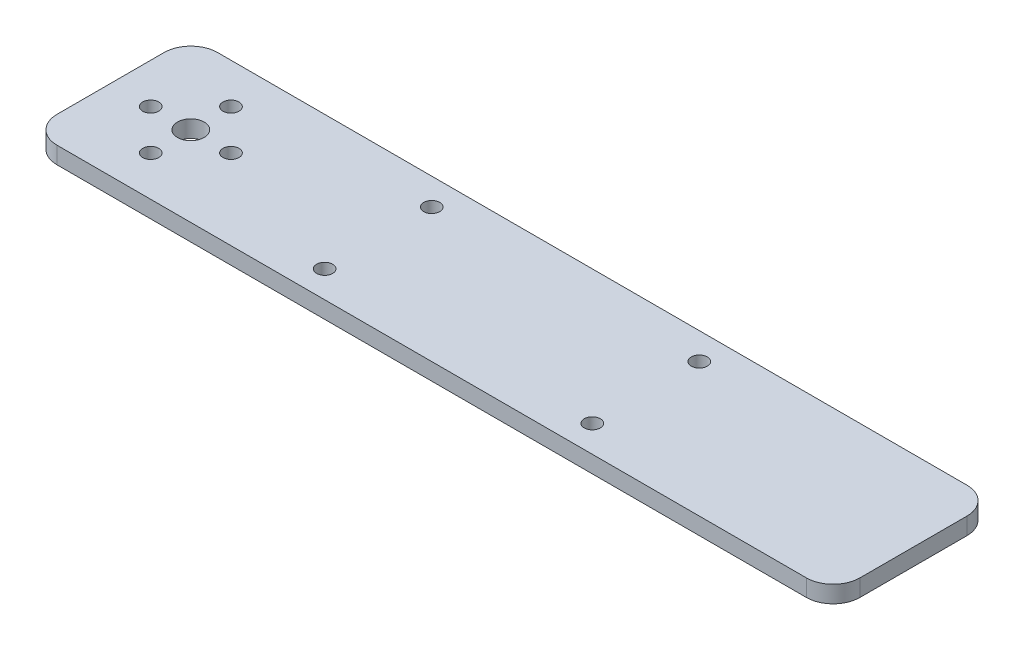
ISO-10303-21;
HEADER;
FILE_DESCRIPTION(('STEP AP214'),'2;1');
FILE_NAME('part.step','',(''),(''),'','','');
FILE_SCHEMA(('AUTOMOTIVE_DESIGN { 1 0 10303 214 1 1 1 1 }'));
ENDSEC;
DATA;
#1=APPLICATION_CONTEXT('core data for automotive mechanical design processes');
#2=APPLICATION_PROTOCOL_DEFINITION('international standard','automotive_design',2000,#1);
#3=PRODUCT_CONTEXT('',#1,'mechanical');
#4=PRODUCT('Part','Part','',(#3));
#5=PRODUCT_RELATED_PRODUCT_CATEGORY('part','',(#4));
#6=PRODUCT_DEFINITION_FORMATION('','',#4);
#7=PRODUCT_DEFINITION_CONTEXT('part definition',#1,'design');
#8=PRODUCT_DEFINITION('design','',#6,#7);
#9=PRODUCT_DEFINITION_SHAPE('','',#8);
#10=(LENGTH_UNIT() NAMED_UNIT(*) SI_UNIT(.MILLI.,.METRE.));
#11=(NAMED_UNIT(*) PLANE_ANGLE_UNIT() SI_UNIT($,.RADIAN.));
#12=(NAMED_UNIT(*) SI_UNIT($,.STERADIAN.) SOLID_ANGLE_UNIT());
#13=UNCERTAINTY_MEASURE_WITH_UNIT(LENGTH_MEASURE(1.E-05),#10,'distance_accuracy_value','');
#14=(GEOMETRIC_REPRESENTATION_CONTEXT(3) GLOBAL_UNCERTAINTY_ASSIGNED_CONTEXT((#13)) GLOBAL_UNIT_ASSIGNED_CONTEXT((#10,
#11,#12)) REPRESENTATION_CONTEXT('',''));
#15=CARTESIAN_POINT('',(0.,0.,0.));
#16=DIRECTION('',(0.,0.,1.));
#17=DIRECTION('',(1.,0.,0.));
#18=AXIS2_PLACEMENT_3D('',#15,#16,#17);
#19=CARTESIAN_POINT('',(-15.,3.175,-15.));
#20=DIRECTION('',(1.,0.,0.));
#21=DIRECTION('',(0.,0.,-1.));
#22=AXIS2_PLACEMENT_3D('',#19,#20,#21);
#23=PLANE('',#22);
#24=DIRECTION('',(0.,0.,1.));
#25=VECTOR('',#24,1.);
#26=CARTESIAN_POINT('',(-15.,3.175,-15.));
#27=LINE('',#26,#25);
#28=CARTESIAN_POINT('',(-15.,3.175,-10.));
#29=VERTEX_POINT('',#28);
#30=CARTESIAN_POINT('',(-15.,3.175,10.));
#31=VERTEX_POINT('',#30);
#32=EDGE_CURVE('E136',#29,#31,#27,.T.);
#33=ORIENTED_EDGE('',*,*,#32,.F.);
#34=DIRECTION('',(0.,-1.,0.));
#35=VECTOR('',#34,1.);
#36=CARTESIAN_POINT('',(-15.,3.175,-10.));
#37=LINE('',#36,#35);
#38=CARTESIAN_POINT('',(-15.,0.,-10.));
#39=VERTEX_POINT('',#38);
#40=EDGE_CURVE('E11',#29,#39,#37,.T.);
#41=ORIENTED_EDGE('',*,*,#40,.T.);
#42=DIRECTION('',(0.,0.,1.));
#43=VECTOR('',#42,1.);
#44=CARTESIAN_POINT('',(-15.,0.,-15.));
#45=LINE('',#44,#43);
#46=CARTESIAN_POINT('',(-15.,0.,10.));
#47=VERTEX_POINT('',#46);
#48=EDGE_CURVE('E138',#39,#47,#45,.T.);
#49=ORIENTED_EDGE('',*,*,#48,.T.);
#50=DIRECTION('',(0.,-1.,0.));
#51=VECTOR('',#50,1.);
#52=CARTESIAN_POINT('',(-15.,3.175,10.));
#53=LINE('',#52,#51);
#54=EDGE_CURVE('E48',#47,#31,#53,.F.);
#55=ORIENTED_EDGE('',*,*,#54,.T.);
#56=EDGE_LOOP('',(#33,#41,#49,#55));
#57=FACE_BOUND('',#56,.T.);
#58=ADVANCED_FACE('F39',(#57),#23,.F.);
#59=CARTESIAN_POINT('',(-15.,3.175,15.));
#60=DIRECTION('',(0.,0.,-1.));
#61=DIRECTION('',(-1.,0.,0.));
#62=AXIS2_PLACEMENT_3D('',#59,#60,#61);
#63=PLANE('',#62);
#64=DIRECTION('',(1.,0.,0.));
#65=VECTOR('',#64,1.);
#66=CARTESIAN_POINT('',(-15.,0.,15.));
#67=LINE('',#66,#65);
#68=CARTESIAN_POINT('',(-9.99999999999999,0.,15.));
#69=VERTEX_POINT('',#68);
#70=CARTESIAN_POINT('',(130.,0.,15.));
#71=VERTEX_POINT('',#70);
#72=EDGE_CURVE('E134',#69,#71,#67,.T.);
#73=ORIENTED_EDGE('',*,*,#72,.T.);
#74=DIRECTION('',(0.,-1.,0.));
#75=VECTOR('',#74,1.);
#76=CARTESIAN_POINT('',(130.,3.175,15.));
#77=LINE('',#76,#75);
#78=CARTESIAN_POINT('',(130.,3.175,15.));
#79=VERTEX_POINT('',#78);
#80=EDGE_CURVE('E113',#71,#79,#77,.F.);
#81=ORIENTED_EDGE('',*,*,#80,.T.);
#82=DIRECTION('',(1.,0.,0.));
#83=VECTOR('',#82,1.);
#84=CARTESIAN_POINT('',(-15.,3.175,15.));
#85=LINE('',#84,#83);
#86=CARTESIAN_POINT('',(-9.99999999999999,3.175,15.));
#87=VERTEX_POINT('',#86);
#88=EDGE_CURVE('E196',#87,#79,#85,.T.);
#89=ORIENTED_EDGE('',*,*,#88,.F.);
#90=DIRECTION('',(0.,-1.,0.));
#91=VECTOR('',#90,1.);
#92=CARTESIAN_POINT('',(-9.99999999999999,3.175,15.));
#93=LINE('',#92,#91);
#94=EDGE_CURVE('E118',#87,#69,#93,.T.);
#95=ORIENTED_EDGE('',*,*,#94,.T.);
#96=EDGE_LOOP('',(#73,#81,#89,#95));
#97=FACE_BOUND('',#96,.T.);
#98=ADVANCED_FACE('F212',(#97),#63,.F.);
#99=CARTESIAN_POINT('',(135.,3.175,-15.));
#100=DIRECTION('',(-1.,0.,0.));
#101=DIRECTION('',(0.,0.,1.));
#102=AXIS2_PLACEMENT_3D('',#99,#100,#101);
#103=PLANE('',#102);
#104=DIRECTION('',(0.,0.,-1.));
#105=VECTOR('',#104,1.);
#106=CARTESIAN_POINT('',(135.,3.175,-15.));
#107=LINE('',#106,#105);
#108=CARTESIAN_POINT('',(135.,3.175,10.));
#109=VERTEX_POINT('',#108);
#110=CARTESIAN_POINT('',(135.,3.175,-10.));
#111=VERTEX_POINT('',#110);
#112=EDGE_CURVE('E127',#109,#111,#107,.T.);
#113=ORIENTED_EDGE('',*,*,#112,.F.);
#114=DIRECTION('',(0.,-1.,0.));
#115=VECTOR('',#114,1.);
#116=CARTESIAN_POINT('',(135.,3.175,10.));
#117=LINE('',#116,#115);
#118=CARTESIAN_POINT('',(135.,0.,10.));
#119=VERTEX_POINT('',#118);
#120=EDGE_CURVE('E112',#109,#119,#117,.T.);
#121=ORIENTED_EDGE('',*,*,#120,.T.);
#122=DIRECTION('',(0.,0.,-1.));
#123=VECTOR('',#122,1.);
#124=CARTESIAN_POINT('',(135.,0.,-15.));
#125=LINE('',#124,#123);
#126=CARTESIAN_POINT('',(135.,0.,-10.));
#127=VERTEX_POINT('',#126);
#128=EDGE_CURVE('E125',#119,#127,#125,.T.);
#129=ORIENTED_EDGE('',*,*,#128,.T.);
#130=DIRECTION('',(0.,-1.,0.));
#131=VECTOR('',#130,1.);
#132=CARTESIAN_POINT('',(135.,3.175,-10.));
#133=LINE('',#132,#131);
#134=EDGE_CURVE('E129',#127,#111,#133,.F.);
#135=ORIENTED_EDGE('',*,*,#134,.T.);
#136=EDGE_LOOP('',(#113,#121,#129,#135));
#137=FACE_BOUND('',#136,.T.);
#138=ADVANCED_FACE('F124',(#137),#103,.F.);
#139=CARTESIAN_POINT('',(-15.,3.175,-15.));
#140=DIRECTION('',(0.,0.,1.));
#141=DIRECTION('',(1.,0.,0.));
#142=AXIS2_PLACEMENT_3D('',#139,#140,#141);
#143=PLANE('',#142);
#144=DIRECTION('',(-1.,0.,0.));
#145=VECTOR('',#144,1.);
#146=CARTESIAN_POINT('',(-15.,3.175,-15.));
#147=LINE('',#146,#145);
#148=CARTESIAN_POINT('',(130.,3.175,-15.));
#149=VERTEX_POINT('',#148);
#150=CARTESIAN_POINT('',(-9.99999999999999,3.175,-15.));
#151=VERTEX_POINT('',#150);
#152=EDGE_CURVE('E142',#149,#151,#147,.T.);
#153=ORIENTED_EDGE('',*,*,#152,.F.);
#154=DIRECTION('',(0.,-1.,0.));
#155=VECTOR('',#154,1.);
#156=CARTESIAN_POINT('',(130.,3.175,-15.));
#157=LINE('',#156,#155);
#158=CARTESIAN_POINT('',(130.,0.,-15.));
#159=VERTEX_POINT('',#158);
#160=EDGE_CURVE('E159',#149,#159,#157,.T.);
#161=ORIENTED_EDGE('',*,*,#160,.T.);
#162=DIRECTION('',(-1.,0.,0.));
#163=VECTOR('',#162,1.);
#164=CARTESIAN_POINT('',(-15.,0.,-15.));
#165=LINE('',#164,#163);
#166=CARTESIAN_POINT('',(-9.99999999999999,0.,-15.));
#167=VERTEX_POINT('',#166);
#168=EDGE_CURVE('E133',#159,#167,#165,.T.);
#169=ORIENTED_EDGE('',*,*,#168,.T.);
#170=DIRECTION('',(0.,-1.,0.));
#171=VECTOR('',#170,1.);
#172=CARTESIAN_POINT('',(-9.99999999999999,3.175,-15.));
#173=LINE('',#172,#171);
#174=EDGE_CURVE('E56',#167,#151,#173,.F.);
#175=ORIENTED_EDGE('',*,*,#174,.T.);
#176=EDGE_LOOP('',(#153,#161,#169,#175));
#177=FACE_BOUND('',#176,.T.);
#178=ADVANCED_FACE('F219',(#177),#143,.F.);
#179=CARTESIAN_POINT('',(0.,3.175,0.));
#180=DIRECTION('',(0.,1.,0.));
#181=DIRECTION('',(0.,0.,1.));
#182=AXIS2_PLACEMENT_3D('',#179,#180,#181);
#183=PLANE('',#182);
#184=CARTESIAN_POINT('',(35.,3.175,-9.99999999999999));
#185=DIRECTION('',(0.,1.,0.));
#186=DIRECTION('',(0.,0.,-1.));
#187=AXIS2_PLACEMENT_3D('',#184,#185,#186);
#188=CIRCLE('',#187,1.5);
#189=CARTESIAN_POINT('',(35.,3.175,-11.5));
#190=VERTEX_POINT('',#189);
#191=EDGE_CURVE('E323',#190,#190,#188,.T.);
#192=ORIENTED_EDGE('',*,*,#191,.F.);
#193=EDGE_LOOP('',(#192));
#194=FACE_BOUND('',#193,.T.);
#195=CARTESIAN_POINT('',(85.,3.175,-9.99999999999997));
#196=DIRECTION('',(0.,1.,0.));
#197=DIRECTION('',(0.,0.,1.));
#198=AXIS2_PLACEMENT_3D('',#195,#196,#197);
#199=CIRCLE('',#198,1.50000000000001);
#200=CARTESIAN_POINT('',(85.,3.175,-8.49999999999996));
#201=VERTEX_POINT('',#200);
#202=EDGE_CURVE('E326',#201,#201,#199,.T.);
#203=ORIENTED_EDGE('',*,*,#202,.F.);
#204=EDGE_LOOP('',(#203));
#205=FACE_BOUND('',#204,.T.);
#206=CARTESIAN_POINT('',(85.,3.175,9.99999999999997));
#207=DIRECTION('',(0.,1.,0.));
#208=DIRECTION('',(0.,0.,-1.));
#209=AXIS2_PLACEMENT_3D('',#206,#207,#208);
#210=CIRCLE('',#209,1.50000000000001);
#211=CARTESIAN_POINT('',(85.,3.175,8.49999999999996));
#212=VERTEX_POINT('',#211);
#213=EDGE_CURVE('E287',#212,#212,#210,.T.);
#214=ORIENTED_EDGE('',*,*,#213,.F.);
#215=EDGE_LOOP('',(#214));
#216=FACE_BOUND('',#215,.T.);
#217=CARTESIAN_POINT('',(35.,3.175,9.99999999999999));
#218=DIRECTION('',(0.,1.,0.));
#219=DIRECTION('',(0.,0.,1.));
#220=AXIS2_PLACEMENT_3D('',#217,#218,#219);
#221=CIRCLE('',#220,1.5);
#222=CARTESIAN_POINT('',(35.,3.175,11.5));
#223=VERTEX_POINT('',#222);
#224=EDGE_CURVE('E167',#223,#223,#221,.T.);
#225=ORIENTED_EDGE('',*,*,#224,.F.);
#226=EDGE_LOOP('',(#225));
#227=FACE_BOUND('',#226,.T.);
#228=CARTESIAN_POINT('',(7.5,3.175,0.));
#229=DIRECTION('',(0.,1.,0.));
#230=DIRECTION('',(0.,0.,1.));
#231=AXIS2_PLACEMENT_3D('',#228,#229,#230);
#232=CIRCLE('',#231,1.5);
#233=CARTESIAN_POINT('',(7.5,3.175,1.5));
#234=VERTEX_POINT('',#233);
#235=EDGE_CURVE('E317',#234,#234,#232,.T.);
#236=ORIENTED_EDGE('',*,*,#235,.F.);
#237=EDGE_LOOP('',(#236));
#238=FACE_BOUND('',#237,.T.);
#239=CARTESIAN_POINT('',(0.,3.175,7.5));
#240=DIRECTION('',(0.,1.,0.));
#241=DIRECTION('',(0.,0.,1.));
#242=AXIS2_PLACEMENT_3D('',#239,#240,#241);
#243=CIRCLE('',#242,1.5);
#244=CARTESIAN_POINT('',(0.,3.175,9.));
#245=VERTEX_POINT('',#244);
#246=EDGE_CURVE('E310',#245,#245,#243,.T.);
#247=ORIENTED_EDGE('',*,*,#246,.F.);
#248=EDGE_LOOP('',(#247));
#249=FACE_BOUND('',#248,.T.);
#250=CARTESIAN_POINT('',(-7.5,3.175,0.));
#251=DIRECTION('',(0.,1.,0.));
#252=DIRECTION('',(0.,0.,1.));
#253=AXIS2_PLACEMENT_3D('',#250,#251,#252);
#254=CIRCLE('',#253,1.5);
#255=CARTESIAN_POINT('',(-7.5,3.175,1.49999999999995));
#256=VERTEX_POINT('',#255);
#257=EDGE_CURVE('E183',#256,#256,#254,.T.);
#258=ORIENTED_EDGE('',*,*,#257,.F.);
#259=EDGE_LOOP('',(#258));
#260=FACE_BOUND('',#259,.T.);
#261=CARTESIAN_POINT('',(0.,3.175,-7.5));
#262=DIRECTION('',(0.,1.,0.));
#263=DIRECTION('',(0.,0.,1.));
#264=AXIS2_PLACEMENT_3D('',#261,#262,#263);
#265=CIRCLE('',#264,1.5);
#266=CARTESIAN_POINT('',(0.,3.175,-6.));
#267=VERTEX_POINT('',#266);
#268=EDGE_CURVE('E174',#267,#267,#265,.T.);
#269=ORIENTED_EDGE('',*,*,#268,.F.);
#270=EDGE_LOOP('',(#269));
#271=FACE_BOUND('',#270,.T.);
#272=CARTESIAN_POINT('',(0.,3.175,0.));
#273=DIRECTION('',(0.,1.,0.));
#274=DIRECTION('',(0.,0.,1.));
#275=AXIS2_PLACEMENT_3D('',#272,#273,#274);
#276=CIRCLE('',#275,2.5);
#277=CARTESIAN_POINT('',(0.,3.175,2.5));
#278=VERTEX_POINT('',#277);
#279=EDGE_CURVE('E190',#278,#278,#276,.T.);
#280=ORIENTED_EDGE('',*,*,#279,.F.);
#281=EDGE_LOOP('',(#280));
#282=FACE_BOUND('',#281,.T.);
#283=ORIENTED_EDGE('',*,*,#88,.T.);
#284=CARTESIAN_POINT('',(130.,3.175,10.));
#285=DIRECTION('',(0.,1.,0.));
#286=DIRECTION('',(0.,0.,1.));
#287=AXIS2_PLACEMENT_3D('',#284,#285,#286);
#288=CIRCLE('',#287,5.);
#289=EDGE_CURVE('E156',#79,#109,#288,.T.);
#290=ORIENTED_EDGE('',*,*,#289,.T.);
#291=ORIENTED_EDGE('',*,*,#112,.T.);
#292=CARTESIAN_POINT('',(130.,3.175,-10.));
#293=DIRECTION('',(0.,1.,0.));
#294=DIRECTION('',(0.,0.,1.));
#295=AXIS2_PLACEMENT_3D('',#292,#293,#294);
#296=CIRCLE('',#295,5.);
#297=EDGE_CURVE('E63',#111,#149,#296,.T.);
#298=ORIENTED_EDGE('',*,*,#297,.T.);
#299=ORIENTED_EDGE('',*,*,#152,.T.);
#300=CARTESIAN_POINT('',(-9.99999999999999,3.175,-10.));
#301=DIRECTION('',(0.,1.,0.));
#302=DIRECTION('',(0.,0.,1.));
#303=AXIS2_PLACEMENT_3D('',#300,#301,#302);
#304=CIRCLE('',#303,5.);
#305=EDGE_CURVE('E153',#151,#29,#304,.T.);
#306=ORIENTED_EDGE('',*,*,#305,.T.);
#307=ORIENTED_EDGE('',*,*,#32,.T.);
#308=CARTESIAN_POINT('',(-9.99999999999999,3.175,10.));
#309=DIRECTION('',(0.,1.,0.));
#310=DIRECTION('',(0.,0.,1.));
#311=AXIS2_PLACEMENT_3D('',#308,#309,#310);
#312=CIRCLE('',#311,5.);
#313=EDGE_CURVE('E151',#31,#87,#312,.T.);
#314=ORIENTED_EDGE('',*,*,#313,.T.);
#315=EDGE_LOOP('',(#283,#290,#291,#298,#299,#306,#307,#314));
#316=FACE_BOUND('',#315,.T.);
#317=ADVANCED_FACE('F210',(#194,#205,#216,#227,#238,#249,#260,#271,#282,#316),#183,.T.);
#318=CARTESIAN_POINT('',(0.,0.,0.));
#319=DIRECTION('',(0.,1.,0.));
#320=DIRECTION('',(0.,0.,1.));
#321=AXIS2_PLACEMENT_3D('',#318,#319,#320);
#322=PLANE('',#321);
#323=CARTESIAN_POINT('',(35.,0.,-9.99999999999999));
#324=DIRECTION('',(0.,1.,0.));
#325=DIRECTION('',(0.,0.,1.));
#326=AXIS2_PLACEMENT_3D('',#323,#324,#325);
#327=CIRCLE('',#326,1.5);
#328=CARTESIAN_POINT('',(35.,0.,-8.49999999999999));
#329=VERTEX_POINT('',#328);
#330=EDGE_CURVE('E43',#329,#329,#327,.T.);
#331=ORIENTED_EDGE('',*,*,#330,.T.);
#332=EDGE_LOOP('',(#331));
#333=FACE_BOUND('',#332,.T.);
#334=CARTESIAN_POINT('',(85.,0.,-9.99999999999997));
#335=DIRECTION('',(0.,1.,0.));
#336=DIRECTION('',(0.,0.,1.));
#337=AXIS2_PLACEMENT_3D('',#334,#335,#336);
#338=CIRCLE('',#337,1.50000000000001);
#339=CARTESIAN_POINT('',(85.,0.,-8.49999999999996));
#340=VERTEX_POINT('',#339);
#341=EDGE_CURVE('E169',#340,#340,#338,.T.);
#342=ORIENTED_EDGE('',*,*,#341,.T.);
#343=EDGE_LOOP('',(#342));
#344=FACE_BOUND('',#343,.T.);
#345=CARTESIAN_POINT('',(85.,0.,9.99999999999997));
#346=DIRECTION('',(0.,1.,0.));
#347=DIRECTION('',(0.,0.,1.));
#348=AXIS2_PLACEMENT_3D('',#345,#346,#347);
#349=CIRCLE('',#348,1.50000000000001);
#350=CARTESIAN_POINT('',(85.,0.,11.5));
#351=VERTEX_POINT('',#350);
#352=EDGE_CURVE('E166',#351,#351,#349,.T.);
#353=ORIENTED_EDGE('',*,*,#352,.T.);
#354=EDGE_LOOP('',(#353));
#355=FACE_BOUND('',#354,.T.);
#356=CARTESIAN_POINT('',(35.,0.,9.99999999999999));
#357=DIRECTION('',(0.,1.,0.));
#358=DIRECTION('',(0.,0.,1.));
#359=AXIS2_PLACEMENT_3D('',#356,#357,#358);
#360=CIRCLE('',#359,1.5);
#361=CARTESIAN_POINT('',(35.,0.,11.5));
#362=VERTEX_POINT('',#361);
#363=EDGE_CURVE('E163',#362,#362,#360,.T.);
#364=ORIENTED_EDGE('',*,*,#363,.T.);
#365=EDGE_LOOP('',(#364));
#366=FACE_BOUND('',#365,.T.);
#367=CARTESIAN_POINT('',(7.5,0.,0.));
#368=DIRECTION('',(0.,1.,0.));
#369=DIRECTION('',(0.,0.,1.));
#370=AXIS2_PLACEMENT_3D('',#367,#368,#369);
#371=CIRCLE('',#370,1.5);
#372=CARTESIAN_POINT('',(7.5,0.,1.5));
#373=VERTEX_POINT('',#372);
#374=EDGE_CURVE('E193',#373,#373,#371,.T.);
#375=ORIENTED_EDGE('',*,*,#374,.T.);
#376=EDGE_LOOP('',(#375));
#377=FACE_BOUND('',#376,.T.);
#378=CARTESIAN_POINT('',(0.,0.,7.5));
#379=DIRECTION('',(0.,1.,0.));
#380=DIRECTION('',(0.,0.,1.));
#381=AXIS2_PLACEMENT_3D('',#378,#379,#380);
#382=CIRCLE('',#381,1.5);
#383=CARTESIAN_POINT('',(0.,0.,9.));
#384=VERTEX_POINT('',#383);
#385=EDGE_CURVE('E299',#384,#384,#382,.T.);
#386=ORIENTED_EDGE('',*,*,#385,.T.);
#387=EDGE_LOOP('',(#386));
#388=FACE_BOUND('',#387,.T.);
#389=CARTESIAN_POINT('',(-7.5,0.,0.));
#390=DIRECTION('',(0.,1.,0.));
#391=DIRECTION('',(0.,0.,1.));
#392=AXIS2_PLACEMENT_3D('',#389,#390,#391);
#393=CIRCLE('',#392,1.5);
#394=CARTESIAN_POINT('',(-7.5,0.,1.49999999999995));
#395=VERTEX_POINT('',#394);
#396=EDGE_CURVE('E303',#395,#395,#393,.T.);
#397=ORIENTED_EDGE('',*,*,#396,.T.);
#398=EDGE_LOOP('',(#397));
#399=FACE_BOUND('',#398,.T.);
#400=CARTESIAN_POINT('',(0.,0.,-7.5));
#401=DIRECTION('',(0.,1.,0.));
#402=DIRECTION('',(0.,0.,1.));
#403=AXIS2_PLACEMENT_3D('',#400,#401,#402);
#404=CIRCLE('',#403,1.5);
#405=CARTESIAN_POINT('',(0.,0.,-6.));
#406=VERTEX_POINT('',#405);
#407=EDGE_CURVE('E178',#406,#406,#404,.T.);
#408=ORIENTED_EDGE('',*,*,#407,.T.);
#409=EDGE_LOOP('',(#408));
#410=FACE_BOUND('',#409,.T.);
#411=CARTESIAN_POINT('',(0.,0.,0.));
#412=DIRECTION('',(0.,1.,0.));
#413=DIRECTION('',(0.,0.,1.));
#414=AXIS2_PLACEMENT_3D('',#411,#412,#413);
#415=CIRCLE('',#414,2.5);
#416=CARTESIAN_POINT('',(0.,0.,2.5));
#417=VERTEX_POINT('',#416);
#418=EDGE_CURVE('E187',#417,#417,#415,.T.);
#419=ORIENTED_EDGE('',*,*,#418,.T.);
#420=EDGE_LOOP('',(#419));
#421=FACE_BOUND('',#420,.T.);
#422=ORIENTED_EDGE('',*,*,#128,.F.);
#423=CARTESIAN_POINT('',(130.,0.,10.));
#424=DIRECTION('',(0.,1.,0.));
#425=DIRECTION('',(0.,0.,1.));
#426=AXIS2_PLACEMENT_3D('',#423,#424,#425);
#427=CIRCLE('',#426,5.);
#428=EDGE_CURVE('E108',#119,#71,#427,.F.);
#429=ORIENTED_EDGE('',*,*,#428,.T.);
#430=ORIENTED_EDGE('',*,*,#72,.F.);
#431=CARTESIAN_POINT('',(-9.99999999999999,0.,10.));
#432=DIRECTION('',(0.,1.,0.));
#433=DIRECTION('',(0.,0.,1.));
#434=AXIS2_PLACEMENT_3D('',#431,#432,#433);
#435=CIRCLE('',#434,5.);
#436=EDGE_CURVE('E128',#69,#47,#435,.F.);
#437=ORIENTED_EDGE('',*,*,#436,.T.);
#438=ORIENTED_EDGE('',*,*,#48,.F.);
#439=CARTESIAN_POINT('',(-9.99999999999999,0.,-10.));
#440=DIRECTION('',(0.,1.,0.));
#441=DIRECTION('',(0.,0.,1.));
#442=AXIS2_PLACEMENT_3D('',#439,#440,#441);
#443=CIRCLE('',#442,5.);
#444=EDGE_CURVE('E145',#39,#167,#443,.F.);
#445=ORIENTED_EDGE('',*,*,#444,.T.);
#446=ORIENTED_EDGE('',*,*,#168,.F.);
#447=CARTESIAN_POINT('',(130.,0.,-10.));
#448=DIRECTION('',(0.,1.,0.));
#449=DIRECTION('',(0.,0.,1.));
#450=AXIS2_PLACEMENT_3D('',#447,#448,#449);
#451=CIRCLE('',#450,5.);
#452=EDGE_CURVE('E119',#159,#127,#451,.F.);
#453=ORIENTED_EDGE('',*,*,#452,.T.);
#454=EDGE_LOOP('',(#422,#429,#430,#437,#438,#445,#446,#453));
#455=FACE_BOUND('',#454,.T.);
#456=ADVANCED_FACE('F131',(#333,#344,#355,#366,#377,#388,#399,#410,#421,#455),#322,.F.);
#457=CARTESIAN_POINT('',(130.,3.175,10.));
#458=DIRECTION('',(0.,-1.,0.));
#459=DIRECTION('',(0.,0.,-1.));
#460=AXIS2_PLACEMENT_3D('',#457,#458,#459);
#461=CYLINDRICAL_SURFACE('',#460,5.);
#462=ORIENTED_EDGE('',*,*,#289,.F.);
#463=ORIENTED_EDGE('',*,*,#80,.F.);
#464=ORIENTED_EDGE('',*,*,#428,.F.);
#465=ORIENTED_EDGE('',*,*,#120,.F.);
#466=EDGE_LOOP('',(#462,#463,#464,#465));
#467=FACE_BOUND('',#466,.T.);
#468=ADVANCED_FACE('F111',(#467),#461,.T.);
#469=CARTESIAN_POINT('',(130.,3.175,-10.));
#470=DIRECTION('',(0.,-1.,0.));
#471=DIRECTION('',(0.,0.,-1.));
#472=AXIS2_PLACEMENT_3D('',#469,#470,#471);
#473=CYLINDRICAL_SURFACE('',#472,5.);
#474=ORIENTED_EDGE('',*,*,#297,.F.);
#475=ORIENTED_EDGE('',*,*,#134,.F.);
#476=ORIENTED_EDGE('',*,*,#452,.F.);
#477=ORIENTED_EDGE('',*,*,#160,.F.);
#478=EDGE_LOOP('',(#474,#475,#476,#477));
#479=FACE_BOUND('',#478,.T.);
#480=ADVANCED_FACE('F226',(#479),#473,.T.);
#481=CARTESIAN_POINT('',(-9.99999999999999,3.175,-10.));
#482=DIRECTION('',(0.,-1.,0.));
#483=DIRECTION('',(0.,0.,-1.));
#484=AXIS2_PLACEMENT_3D('',#481,#482,#483);
#485=CYLINDRICAL_SURFACE('',#484,5.);
#486=ORIENTED_EDGE('',*,*,#305,.F.);
#487=ORIENTED_EDGE('',*,*,#174,.F.);
#488=ORIENTED_EDGE('',*,*,#444,.F.);
#489=ORIENTED_EDGE('',*,*,#40,.F.);
#490=EDGE_LOOP('',(#486,#487,#488,#489));
#491=FACE_BOUND('',#490,.T.);
#492=ADVANCED_FACE('F228',(#491),#485,.T.);
#493=CARTESIAN_POINT('',(-9.99999999999999,3.175,10.));
#494=DIRECTION('',(0.,-1.,0.));
#495=DIRECTION('',(0.,0.,-1.));
#496=AXIS2_PLACEMENT_3D('',#493,#494,#495);
#497=CYLINDRICAL_SURFACE('',#496,5.);
#498=ORIENTED_EDGE('',*,*,#313,.F.);
#499=ORIENTED_EDGE('',*,*,#54,.F.);
#500=ORIENTED_EDGE('',*,*,#436,.F.);
#501=ORIENTED_EDGE('',*,*,#94,.F.);
#502=EDGE_LOOP('',(#498,#499,#500,#501));
#503=FACE_BOUND('',#502,.T.);
#504=ADVANCED_FACE('F41',(#503),#497,.T.);
#505=CARTESIAN_POINT('',(0.,0.,0.));
#506=DIRECTION('',(0.,1.,0.));
#507=DIRECTION('',(0.,0.,1.));
#508=AXIS2_PLACEMENT_3D('',#505,#506,#507);
#509=CYLINDRICAL_SURFACE('',#508,2.5);
#510=ORIENTED_EDGE('',*,*,#418,.F.);
#511=EDGE_LOOP('',(#510));
#512=FACE_BOUND('',#511,.T.);
#513=ORIENTED_EDGE('',*,*,#279,.T.);
#514=EDGE_LOOP('',(#513));
#515=FACE_BOUND('',#514,.T.);
#516=ADVANCED_FACE('F235',(#512,#515),#509,.F.);
#517=CARTESIAN_POINT('',(0.,0.,-7.5));
#518=DIRECTION('',(0.,1.,0.));
#519=DIRECTION('',(0.,0.,1.));
#520=AXIS2_PLACEMENT_3D('',#517,#518,#519);
#521=CYLINDRICAL_SURFACE('',#520,1.5);
#522=ORIENTED_EDGE('',*,*,#407,.F.);
#523=EDGE_LOOP('',(#522));
#524=FACE_BOUND('',#523,.T.);
#525=ORIENTED_EDGE('',*,*,#268,.T.);
#526=EDGE_LOOP('',(#525));
#527=FACE_BOUND('',#526,.T.);
#528=ADVANCED_FACE('F250',(#524,#527),#521,.F.);
#529=CARTESIAN_POINT('',(-7.5,0.,0.));
#530=DIRECTION('',(0.,1.,0.));
#531=DIRECTION('',(0.,0.,1.));
#532=AXIS2_PLACEMENT_3D('',#529,#530,#531);
#533=CYLINDRICAL_SURFACE('',#532,1.5);
#534=ORIENTED_EDGE('',*,*,#396,.F.);
#535=EDGE_LOOP('',(#534));
#536=FACE_BOUND('',#535,.T.);
#537=ORIENTED_EDGE('',*,*,#257,.T.);
#538=EDGE_LOOP('',(#537));
#539=FACE_BOUND('',#538,.T.);
#540=ADVANCED_FACE('F254',(#536,#539),#533,.F.);
#541=CARTESIAN_POINT('',(0.,0.,7.5));
#542=DIRECTION('',(0.,1.,0.));
#543=DIRECTION('',(0.,0.,1.));
#544=AXIS2_PLACEMENT_3D('',#541,#542,#543);
#545=CYLINDRICAL_SURFACE('',#544,1.5);
#546=ORIENTED_EDGE('',*,*,#385,.F.);
#547=EDGE_LOOP('',(#546));
#548=FACE_BOUND('',#547,.T.);
#549=ORIENTED_EDGE('',*,*,#246,.T.);
#550=EDGE_LOOP('',(#549));
#551=FACE_BOUND('',#550,.T.);
#552=ADVANCED_FACE('F258',(#548,#551),#545,.F.);
#553=CARTESIAN_POINT('',(7.5,0.,0.));
#554=DIRECTION('',(0.,1.,0.));
#555=DIRECTION('',(0.,0.,1.));
#556=AXIS2_PLACEMENT_3D('',#553,#554,#555);
#557=CYLINDRICAL_SURFACE('',#556,1.5);
#558=ORIENTED_EDGE('',*,*,#374,.F.);
#559=EDGE_LOOP('',(#558));
#560=FACE_BOUND('',#559,.T.);
#561=ORIENTED_EDGE('',*,*,#235,.T.);
#562=EDGE_LOOP('',(#561));
#563=FACE_BOUND('',#562,.T.);
#564=ADVANCED_FACE('F262',(#560,#563),#557,.F.);
#565=CARTESIAN_POINT('',(35.,-6.825,9.99999999999999));
#566=DIRECTION('',(0.,1.,0.));
#567=DIRECTION('',(0.,0.,1.));
#568=AXIS2_PLACEMENT_3D('',#565,#566,#567);
#569=CYLINDRICAL_SURFACE('',#568,1.5);
#570=ORIENTED_EDGE('',*,*,#224,.T.);
#571=EDGE_LOOP('',(#570));
#572=FACE_BOUND('',#571,.T.);
#573=ORIENTED_EDGE('',*,*,#363,.F.);
#574=EDGE_LOOP('',(#573));
#575=FACE_BOUND('',#574,.T.);
#576=ADVANCED_FACE('F266',(#572,#575),#569,.F.);
#577=CARTESIAN_POINT('',(85.,-6.825,9.99999999999997));
#578=DIRECTION('',(0.,1.,0.));
#579=DIRECTION('',(0.,0.,1.));
#580=AXIS2_PLACEMENT_3D('',#577,#578,#579);
#581=CYLINDRICAL_SURFACE('',#580,1.50000000000001);
#582=ORIENTED_EDGE('',*,*,#213,.T.);
#583=EDGE_LOOP('',(#582));
#584=FACE_BOUND('',#583,.T.);
#585=ORIENTED_EDGE('',*,*,#352,.F.);
#586=EDGE_LOOP('',(#585));
#587=FACE_BOUND('',#586,.T.);
#588=ADVANCED_FACE('F270',(#584,#587),#581,.F.);
#589=CARTESIAN_POINT('',(85.,-6.825,-9.99999999999997));
#590=DIRECTION('',(0.,1.,0.));
#591=DIRECTION('',(0.,0.,1.));
#592=AXIS2_PLACEMENT_3D('',#589,#590,#591);
#593=CYLINDRICAL_SURFACE('',#592,1.50000000000001);
#594=ORIENTED_EDGE('',*,*,#202,.T.);
#595=EDGE_LOOP('',(#594));
#596=FACE_BOUND('',#595,.T.);
#597=ORIENTED_EDGE('',*,*,#341,.F.);
#598=EDGE_LOOP('',(#597));
#599=FACE_BOUND('',#598,.T.);
#600=ADVANCED_FACE('F275',(#596,#599),#593,.F.);
#601=CARTESIAN_POINT('',(35.,-6.825,-9.99999999999999));
#602=DIRECTION('',(0.,1.,0.));
#603=DIRECTION('',(0.,0.,1.));
#604=AXIS2_PLACEMENT_3D('',#601,#602,#603);
#605=CYLINDRICAL_SURFACE('',#604,1.5);
#606=ORIENTED_EDGE('',*,*,#191,.T.);
#607=EDGE_LOOP('',(#606));
#608=FACE_BOUND('',#607,.T.);
#609=ORIENTED_EDGE('',*,*,#330,.F.);
#610=EDGE_LOOP('',(#609));
#611=FACE_BOUND('',#610,.T.);
#612=ADVANCED_FACE('F272',(#608,#611),#605,.F.);
#613=CLOSED_SHELL('',(#58,#98,#138,#178,#317,#456,#468,#480,#492,#504,#516,#528,#540,#552,#564,
#576,#588,#600,#612));
#614=MANIFOLD_SOLID_BREP('B2',#613);
#615=ADVANCED_BREP_SHAPE_REPRESENTATION('',(#18,#614),#14);
#616=SHAPE_DEFINITION_REPRESENTATION(#9,#615);
ENDSEC;
END-ISO-10303-21;
